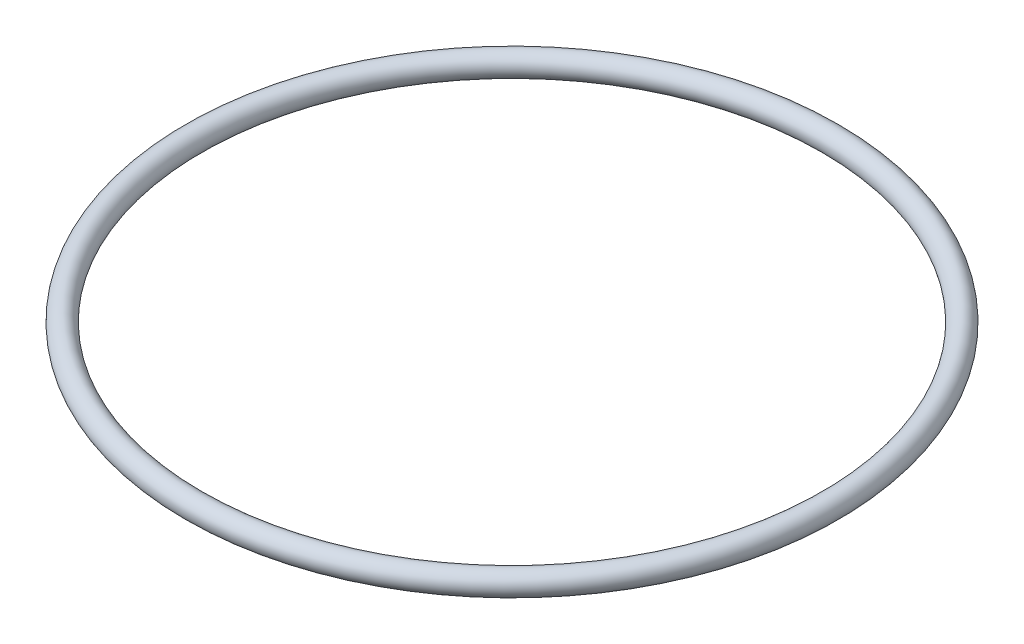
ISO-10303-21;
HEADER;
FILE_DESCRIPTION(('STEP AP214'),'2;1');
FILE_NAME('part.step','',(''),(''),'','','');
FILE_SCHEMA(('AUTOMOTIVE_DESIGN { 1 0 10303 214 1 1 1 1 }'));
ENDSEC;
DATA;
#1=APPLICATION_CONTEXT('core data for automotive mechanical design processes');
#2=APPLICATION_PROTOCOL_DEFINITION('international standard','automotive_design',2000,#1);
#3=PRODUCT_CONTEXT('',#1,'mechanical');
#4=PRODUCT('Part','Part','',(#3));
#5=PRODUCT_RELATED_PRODUCT_CATEGORY('part','',(#4));
#6=PRODUCT_DEFINITION_FORMATION('','',#4);
#7=PRODUCT_DEFINITION_CONTEXT('part definition',#1,'design');
#8=PRODUCT_DEFINITION('design','',#6,#7);
#9=PRODUCT_DEFINITION_SHAPE('','',#8);
#10=(LENGTH_UNIT() NAMED_UNIT(*) SI_UNIT(.MILLI.,.METRE.));
#11=(NAMED_UNIT(*) PLANE_ANGLE_UNIT() SI_UNIT($,.RADIAN.));
#12=(NAMED_UNIT(*) SI_UNIT($,.STERADIAN.) SOLID_ANGLE_UNIT());
#13=UNCERTAINTY_MEASURE_WITH_UNIT(LENGTH_MEASURE(1.E-05),#10,'distance_accuracy_value','');
#14=(GEOMETRIC_REPRESENTATION_CONTEXT(3) GLOBAL_UNCERTAINTY_ASSIGNED_CONTEXT((#13)) GLOBAL_UNIT_ASSIGNED_CONTEXT((#10,
#11,#12)) REPRESENTATION_CONTEXT('',''));
#15=CARTESIAN_POINT('',(0.,0.,0.));
#16=DIRECTION('',(0.,0.,1.));
#17=DIRECTION('',(1.,0.,0.));
#18=AXIS2_PLACEMENT_3D('',#15,#16,#17);
#19=CARTESIAN_POINT('',(0.,0.,0.));
#20=DIRECTION('',(0.,1.,0.));
#21=DIRECTION('',(0.,0.,1.));
#22=AXIS2_PLACEMENT_3D('',#19,#20,#21);
#23=TOROIDAL_SURFACE('',#22,34.75,1.25);
#24=CARTESIAN_POINT('',(0.,0.,36.));
#25=VERTEX_POINT('',#24);
#26=VERTEX_LOOP('',#25);
#27=FACE_BOUND('',#26,.T.);
#28=ADVANCED_FACE('F31',(#27),#23,.T.);
#29=CLOSED_SHELL('',(#28));
#30=MANIFOLD_SOLID_BREP('B2',#29);
#31=ADVANCED_BREP_SHAPE_REPRESENTATION('',(#18,#30),#14);
#32=SHAPE_DEFINITION_REPRESENTATION(#9,#31);
ENDSEC;
END-ISO-10303-21;
